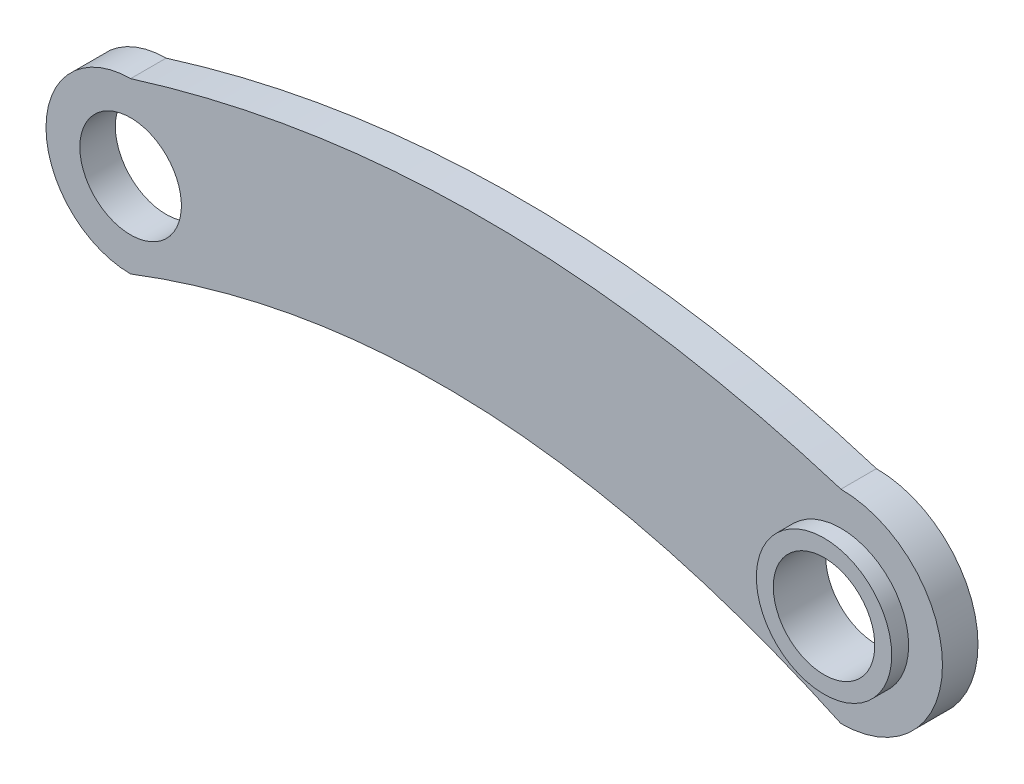
ISO-10303-21;
HEADER;
FILE_DESCRIPTION(('STEP AP214'),'2;1');
FILE_NAME('part.step','',(''),(''),'','','');
FILE_SCHEMA(('AUTOMOTIVE_DESIGN { 1 0 10303 214 1 1 1 1 }'));
ENDSEC;
DATA;
#1=APPLICATION_CONTEXT('core data for automotive mechanical design processes');
#2=APPLICATION_PROTOCOL_DEFINITION('international standard','automotive_design',2000,#1);
#3=PRODUCT_CONTEXT('',#1,'mechanical');
#4=PRODUCT('Part','Part','',(#3));
#5=PRODUCT_RELATED_PRODUCT_CATEGORY('part','',(#4));
#6=PRODUCT_DEFINITION_FORMATION('','',#4);
#7=PRODUCT_DEFINITION_CONTEXT('part definition',#1,'design');
#8=PRODUCT_DEFINITION('design','',#6,#7);
#9=PRODUCT_DEFINITION_SHAPE('','',#8);
#10=(LENGTH_UNIT() NAMED_UNIT(*) SI_UNIT(.MILLI.,.METRE.));
#11=(NAMED_UNIT(*) PLANE_ANGLE_UNIT() SI_UNIT($,.RADIAN.));
#12=(NAMED_UNIT(*) SI_UNIT($,.STERADIAN.) SOLID_ANGLE_UNIT());
#13=UNCERTAINTY_MEASURE_WITH_UNIT(LENGTH_MEASURE(1.E-05),#10,'distance_accuracy_value','');
#14=(GEOMETRIC_REPRESENTATION_CONTEXT(3) GLOBAL_UNCERTAINTY_ASSIGNED_CONTEXT((#13)) GLOBAL_UNIT_ASSIGNED_CONTEXT((#10,
#11,#12)) REPRESENTATION_CONTEXT('',''));
#15=CARTESIAN_POINT('',(0.,0.,0.));
#16=DIRECTION('',(0.,0.,1.));
#17=DIRECTION('',(1.,0.,0.));
#18=AXIS2_PLACEMENT_3D('',#15,#16,#17);
#19=CARTESIAN_POINT('',(0.,0.,21.));
#20=DIRECTION('',(0.,0.,1.));
#21=DIRECTION('',(1.,0.,0.));
#22=AXIS2_PLACEMENT_3D('',#19,#20,#21);
#23=PLANE('',#22);
#24=CARTESIAN_POINT('',(-267.733324074029,336.480114093346,21.));
#25=DIRECTION('',(0.,0.,1.));
#26=DIRECTION('',(1.,0.,0.));
#27=AXIS2_PLACEMENT_3D('',#24,#25,#26);
#28=CIRCLE('',#27,50.);
#29=CARTESIAN_POINT('',(-267.733324074029,386.480114093346,21.));
#30=VERTEX_POINT('',#29);
#31=CARTESIAN_POINT('',(-267.733324074029,286.480114093346,21.));
#32=VERTEX_POINT('',#31);
#33=EDGE_CURVE('E98',#30,#32,#28,.T.);
#34=ORIENTED_EDGE('',*,*,#33,.T.);
#35=CARTESIAN_POINT('',(-267.733324074029,286.480114093346,21.));
#36=CARTESIAN_POINT('',(-61.5362998778427,365.75863406684,21.));
#37=CARTESIAN_POINT('',(152.142574226651,266.270803333194,21.));
#38=B_SPLINE_CURVE_WITH_KNOTS('',2,(#35,#36,#37),.UNSPECIFIED.,.F.,.F.,(3,3),(0.,1.),.UNSPECIFIED.);
#39=CARTESIAN_POINT('',(152.142574226651,266.27080333319,21.));
#40=VERTEX_POINT('',#39);
#41=EDGE_CURVE('E89',#32,#40,#38,.T.);
#42=ORIENTED_EDGE('',*,*,#41,.T.);
#43=CARTESIAN_POINT('',(152.142574226651,326.270803333194,21.));
#44=DIRECTION('',(0.,0.,1.));
#45=DIRECTION('',(1.,0.,0.));
#46=AXIS2_PLACEMENT_3D('',#43,#44,#45);
#47=CIRCLE('',#46,60.0000000000038);
#48=CARTESIAN_POINT('',(152.142574226651,386.270803333198,21.));
#49=VERTEX_POINT('',#48);
#50=EDGE_CURVE('E100',#49,#40,#47,.F.);
#51=ORIENTED_EDGE('',*,*,#50,.F.);
#52=CARTESIAN_POINT('',(-267.733324074029,386.480114093346,21.));
#53=CARTESIAN_POINT('',(-58.3768927784346,451.865914160474,21.));
#54=CARTESIAN_POINT('',(152.142574226651,386.270803333194,21.));
#55=B_SPLINE_CURVE_WITH_KNOTS('',2,(#52,#53,#54),.UNSPECIFIED.,.F.,.F.,(3,3),(0.,1.),.UNSPECIFIED.);
#56=EDGE_CURVE('E109',#30,#49,#55,.T.);
#57=ORIENTED_EDGE('',*,*,#56,.F.);
#58=EDGE_LOOP('',(#34,#42,#51,#57));
#59=FACE_BOUND('',#58,.T.);
#60=CARTESIAN_POINT('',(-267.733324074029,336.480114093346,21.));
#61=DIRECTION('',(0.,0.,1.));
#62=DIRECTION('',(1.,0.,0.));
#63=AXIS2_PLACEMENT_3D('',#60,#61,#62);
#64=CIRCLE('',#63,30.);
#65=CARTESIAN_POINT('',(-297.733324074029,336.480114093346,21.));
#66=VERTEX_POINT('',#65);
#67=EDGE_CURVE('E180',#66,#66,#64,.T.);
#68=ORIENTED_EDGE('',*,*,#67,.F.);
#69=EDGE_LOOP('',(#68));
#70=FACE_BOUND('',#69,.T.);
#71=CARTESIAN_POINT('',(152.142574226651,326.270803333194,21.));
#72=DIRECTION('',(0.,0.,1.));
#73=DIRECTION('',(1.,0.,0.));
#74=AXIS2_PLACEMENT_3D('',#71,#72,#73);
#75=CIRCLE('',#74,40.);
#76=CARTESIAN_POINT('',(192.142574226651,326.270803333194,21.));
#77=VERTEX_POINT('',#76);
#78=EDGE_CURVE('E170',#77,#77,#75,.T.);
#79=ORIENTED_EDGE('',*,*,#78,.F.);
#80=EDGE_LOOP('',(#79));
#81=FACE_BOUND('',#80,.T.);
#82=ADVANCED_FACE('F50',(#59,#70,#81),#23,.T.);
#83=CARTESIAN_POINT('',(-267.733324074029,336.480114093346,21.));
#84=DIRECTION('',(0.,0.,-1.));
#85=DIRECTION('',(-1.,0.,0.));
#86=AXIS2_PLACEMENT_3D('',#83,#84,#85);
#87=CYLINDRICAL_SURFACE('',#86,50.);
#88=CARTESIAN_POINT('',(-267.733324074029,336.480114093346,0.));
#89=DIRECTION('',(0.,0.,1.));
#90=DIRECTION('',(1.,0.,0.));
#91=AXIS2_PLACEMENT_3D('',#88,#89,#90);
#92=CIRCLE('',#91,50.);
#93=CARTESIAN_POINT('',(-267.733324074029,386.480114093346,0.));
#94=VERTEX_POINT('',#93);
#95=CARTESIAN_POINT('',(-267.733324074029,286.480114093346,0.));
#96=VERTEX_POINT('',#95);
#97=EDGE_CURVE('E122',#94,#96,#92,.T.);
#98=ORIENTED_EDGE('',*,*,#97,.T.);
#99=DIRECTION('',(0.,0.,-1.));
#100=VECTOR('',#99,1.);
#101=CARTESIAN_POINT('',(-267.733324074029,286.480114093346,21.));
#102=LINE('',#101,#100);
#103=EDGE_CURVE('E11',#32,#96,#102,.T.);
#104=ORIENTED_EDGE('',*,*,#103,.F.);
#105=ORIENTED_EDGE('',*,*,#33,.F.);
#106=DIRECTION('',(0.,0.,-1.));
#107=VECTOR('',#106,1.);
#108=CARTESIAN_POINT('',(-267.733324074029,386.480114093346,21.));
#109=LINE('',#108,#107);
#110=EDGE_CURVE('E62',#30,#94,#109,.T.);
#111=ORIENTED_EDGE('',*,*,#110,.T.);
#112=EDGE_LOOP('',(#98,#104,#105,#111));
#113=FACE_BOUND('',#112,.T.);
#114=ADVANCED_FACE('F47',(#113),#87,.T.);
#115=DIRECTION('',(0.,0.,-1.));
#116=VECTOR('',#115,1.);
#117=SURFACE_OF_LINEAR_EXTRUSION('',#38,#116);
#118=CARTESIAN_POINT('',(-267.733324074029,286.480114093346,0.));
#119=CARTESIAN_POINT('',(-61.5362998778427,365.75863406684,0.));
#120=CARTESIAN_POINT('',(152.142574226651,266.270803333194,0.));
#121=B_SPLINE_CURVE_WITH_KNOTS('',2,(#118,#119,#120),.UNSPECIFIED.,.F.,.F.,(3,3),(0.,1.),.UNSPECIFIED.);
#122=CARTESIAN_POINT('',(152.142574226651,266.27080333319,0.));
#123=VERTEX_POINT('',#122);
#124=EDGE_CURVE('E102',#96,#123,#121,.T.);
#125=ORIENTED_EDGE('',*,*,#124,.T.);
#126=DIRECTION('',(0.,0.,-1.));
#127=VECTOR('',#126,1.);
#128=CARTESIAN_POINT('',(152.142574226651,266.27080333319,21.));
#129=LINE('',#128,#127);
#130=EDGE_CURVE('E60',#40,#123,#129,.T.);
#131=ORIENTED_EDGE('',*,*,#130,.F.);
#132=ORIENTED_EDGE('',*,*,#41,.F.);
#133=ORIENTED_EDGE('',*,*,#103,.T.);
#134=EDGE_LOOP('',(#125,#131,#132,#133));
#135=FACE_BOUND('',#134,.T.);
#136=ADVANCED_FACE('F103',(#135),#117,.F.);
#137=CARTESIAN_POINT('',(152.142574226651,326.270803333194,21.));
#138=DIRECTION('',(0.,0.,-1.));
#139=DIRECTION('',(-1.,0.,0.));
#140=AXIS2_PLACEMENT_3D('',#137,#138,#139);
#141=CYLINDRICAL_SURFACE('',#140,60.0000000000038);
#142=CARTESIAN_POINT('',(152.142574226651,326.270803333194,0.));
#143=DIRECTION('',(0.,0.,1.));
#144=DIRECTION('',(1.,0.,0.));
#145=AXIS2_PLACEMENT_3D('',#142,#143,#144);
#146=CIRCLE('',#145,60.0000000000038);
#147=CARTESIAN_POINT('',(152.142574226651,386.270803333198,0.));
#148=VERTEX_POINT('',#147);
#149=EDGE_CURVE('E189',#148,#123,#146,.F.);
#150=ORIENTED_EDGE('',*,*,#149,.F.);
#151=DIRECTION('',(0.,0.,-1.));
#152=VECTOR('',#151,1.);
#153=CARTESIAN_POINT('',(152.142574226651,386.270803333198,21.));
#154=LINE('',#153,#152);
#155=EDGE_CURVE('E79',#49,#148,#154,.T.);
#156=ORIENTED_EDGE('',*,*,#155,.F.);
#157=ORIENTED_EDGE('',*,*,#50,.T.);
#158=ORIENTED_EDGE('',*,*,#130,.T.);
#159=EDGE_LOOP('',(#150,#156,#157,#158));
#160=FACE_BOUND('',#159,.T.);
#161=ADVANCED_FACE('F107',(#160),#141,.T.);
#162=DIRECTION('',(0.,0.,-1.));
#163=VECTOR('',#162,1.);
#164=SURFACE_OF_LINEAR_EXTRUSION('',#55,#163);
#165=CARTESIAN_POINT('',(-267.733324074029,386.480114093346,0.));
#166=CARTESIAN_POINT('',(-58.3768927784346,451.865914160474,0.));
#167=CARTESIAN_POINT('',(152.142574226651,386.270803333194,0.));
#168=B_SPLINE_CURVE_WITH_KNOTS('',2,(#165,#166,#167),.UNSPECIFIED.,.F.,.F.,(3,3),(0.,1.),.UNSPECIFIED.);
#169=EDGE_CURVE('E190',#94,#148,#168,.T.);
#170=ORIENTED_EDGE('',*,*,#169,.F.);
#171=ORIENTED_EDGE('',*,*,#110,.F.);
#172=ORIENTED_EDGE('',*,*,#56,.T.);
#173=ORIENTED_EDGE('',*,*,#155,.T.);
#174=EDGE_LOOP('',(#170,#171,#172,#173));
#175=FACE_BOUND('',#174,.T.);
#176=ADVANCED_FACE('F129',(#175),#164,.T.);
#177=CARTESIAN_POINT('',(0.,0.,0.));
#178=DIRECTION('',(0.,0.,1.));
#179=DIRECTION('',(1.,0.,0.));
#180=AXIS2_PLACEMENT_3D('',#177,#178,#179);
#181=PLANE('',#180);
#182=CARTESIAN_POINT('',(-267.733324074029,336.480114093346,0.));
#183=DIRECTION('',(0.,0.,1.));
#184=DIRECTION('',(1.,0.,0.));
#185=AXIS2_PLACEMENT_3D('',#182,#183,#184);
#186=CIRCLE('',#185,30.);
#187=CARTESIAN_POINT('',(-297.733324074029,336.480114093346,0.));
#188=VERTEX_POINT('',#187);
#189=EDGE_CURVE('E182',#188,#188,#186,.T.);
#190=ORIENTED_EDGE('',*,*,#189,.T.);
#191=EDGE_LOOP('',(#190));
#192=FACE_BOUND('',#191,.T.);
#193=CARTESIAN_POINT('',(152.142574226651,326.270803333194,0.));
#194=DIRECTION('',(0.,0.,1.));
#195=DIRECTION('',(1.,0.,0.));
#196=AXIS2_PLACEMENT_3D('',#193,#194,#195);
#197=CIRCLE('',#196,30.);
#198=CARTESIAN_POINT('',(122.142574226651,326.270803333194,0.));
#199=VERTEX_POINT('',#198);
#200=EDGE_CURVE('E172',#199,#199,#197,.T.);
#201=ORIENTED_EDGE('',*,*,#200,.T.);
#202=EDGE_LOOP('',(#201));
#203=FACE_BOUND('',#202,.T.);
#204=ORIENTED_EDGE('',*,*,#97,.F.);
#205=ORIENTED_EDGE('',*,*,#169,.T.);
#206=ORIENTED_EDGE('',*,*,#149,.T.);
#207=ORIENTED_EDGE('',*,*,#124,.F.);
#208=EDGE_LOOP('',(#204,#205,#206,#207));
#209=FACE_BOUND('',#208,.T.);
#210=ADVANCED_FACE('F131',(#192,#203,#209),#181,.F.);
#211=CARTESIAN_POINT('',(152.142574226651,326.270803333194,21.));
#212=DIRECTION('',(0.,0.,-1.));
#213=DIRECTION('',(-1.,0.,0.));
#214=AXIS2_PLACEMENT_3D('',#211,#212,#213);
#215=CYLINDRICAL_SURFACE('',#214,30.);
#216=CARTESIAN_POINT('',(152.142574226651,326.270803333194,31.));
#217=DIRECTION('',(0.,0.,1.));
#218=DIRECTION('',(1.,0.,0.));
#219=AXIS2_PLACEMENT_3D('',#216,#217,#218);
#220=CIRCLE('',#219,30.);
#221=CARTESIAN_POINT('',(122.142574226651,326.270803333194,31.));
#222=VERTEX_POINT('',#221);
#223=EDGE_CURVE('E163',#222,#222,#220,.T.);
#224=CARTESIAN_POINT('',(122.142574226651,326.270803333194,0.));
#225=CARTESIAN_POINT('',(122.142574226651,326.270803333194,0.322916666666667));
#226=CARTESIAN_POINT('',(122.142574226651,326.270803333194,0.645833333333334));
#227=CARTESIAN_POINT('',(122.142574226651,326.270803333194,1.29166666666667));
#228=CARTESIAN_POINT('',(122.142574226651,326.270803333194,1.61458333333333));
#229=CARTESIAN_POINT('',(122.142574226651,326.270803333194,2.26041666666667));
#230=CARTESIAN_POINT('',(122.142574226651,326.270803333194,2.58333333333333));
#231=CARTESIAN_POINT('',(122.142574226651,326.270803333194,3.22916666666667));
#232=CARTESIAN_POINT('',(122.142574226651,326.270803333194,3.55208333333333));
#233=CARTESIAN_POINT('',(122.142574226651,326.270803333194,4.19791666666667));
#234=CARTESIAN_POINT('',(122.142574226651,326.270803333194,4.52083333333333));
#235=CARTESIAN_POINT('',(122.142574226651,326.270803333194,5.16666666666667));
#236=CARTESIAN_POINT('',(122.142574226651,326.270803333194,5.48958333333333));
#237=CARTESIAN_POINT('',(122.142574226651,326.270803333194,6.13541666666667));
#238=CARTESIAN_POINT('',(122.142574226651,326.270803333194,6.45833333333333));
#239=CARTESIAN_POINT('',(122.142574226651,326.270803333194,7.10416666666667));
#240=CARTESIAN_POINT('',(122.142574226651,326.270803333194,7.42708333333333));
#241=CARTESIAN_POINT('',(122.142574226651,326.270803333194,8.07291666666667));
#242=CARTESIAN_POINT('',(122.142574226651,326.270803333194,8.39583333333333));
#243=CARTESIAN_POINT('',(122.142574226651,326.270803333194,9.04166666666667));
#244=CARTESIAN_POINT('',(122.142574226651,326.270803333194,9.36458333333333));
#245=CARTESIAN_POINT('',(122.142574226651,326.270803333194,10.0104166666667));
#246=CARTESIAN_POINT('',(122.142574226651,326.270803333194,10.3333333333333));
#247=CARTESIAN_POINT('',(122.142574226651,326.270803333194,10.9791666666667));
#248=CARTESIAN_POINT('',(122.142574226651,326.270803333194,11.3020833333333));
#249=CARTESIAN_POINT('',(122.142574226651,326.270803333194,11.9479166666667));
#250=CARTESIAN_POINT('',(122.142574226651,326.270803333194,12.2708333333333));
#251=CARTESIAN_POINT('',(122.142574226651,326.270803333194,12.9166666666667));
#252=CARTESIAN_POINT('',(122.142574226651,326.270803333194,13.2395833333333));
#253=CARTESIAN_POINT('',(122.142574226651,326.270803333194,13.8854166666667));
#254=CARTESIAN_POINT('',(122.142574226651,326.270803333194,14.2083333333333));
#255=CARTESIAN_POINT('',(122.142574226651,326.270803333194,14.8541666666667));
#256=CARTESIAN_POINT('',(122.142574226651,326.270803333194,15.1770833333333));
#257=CARTESIAN_POINT('',(122.142574226651,326.270803333194,15.8229166666667));
#258=CARTESIAN_POINT('',(122.142574226651,326.270803333194,16.1458333333333));
#259=CARTESIAN_POINT('',(122.142574226651,326.270803333194,16.7916666666667));
#260=CARTESIAN_POINT('',(122.142574226651,326.270803333194,17.1145833333333));
#261=CARTESIAN_POINT('',(122.142574226651,326.270803333194,17.7604166666667));
#262=CARTESIAN_POINT('',(122.142574226651,326.270803333194,18.0833333333333));
#263=CARTESIAN_POINT('',(122.142574226651,326.270803333194,18.7291666666667));
#264=CARTESIAN_POINT('',(122.142574226651,326.270803333194,19.0520833333333));
#265=CARTESIAN_POINT('',(122.142574226651,326.270803333194,19.6979166666667));
#266=CARTESIAN_POINT('',(122.142574226651,326.270803333194,20.0208333333333));
#267=CARTESIAN_POINT('',(122.142574226651,326.270803333194,20.6666666666667));
#268=CARTESIAN_POINT('',(122.142574226651,326.270803333194,20.9895833333333));
#269=CARTESIAN_POINT('',(122.142574226651,326.270803333194,21.6354166666667));
#270=CARTESIAN_POINT('',(122.142574226651,326.270803333194,21.9583333333333));
#271=CARTESIAN_POINT('',(122.142574226651,326.270803333194,22.6041666666667));
#272=CARTESIAN_POINT('',(122.142574226651,326.270803333194,22.9270833333333));
#273=CARTESIAN_POINT('',(122.142574226651,326.270803333194,23.5729166666667));
#274=CARTESIAN_POINT('',(122.142574226651,326.270803333194,23.8958333333333));
#275=CARTESIAN_POINT('',(122.142574226651,326.270803333194,24.5416666666667));
#276=CARTESIAN_POINT('',(122.142574226651,326.270803333194,24.8645833333333));
#277=CARTESIAN_POINT('',(122.142574226651,326.270803333194,25.5104166666667));
#278=CARTESIAN_POINT('',(122.142574226651,326.270803333194,25.8333333333333));
#279=CARTESIAN_POINT('',(122.142574226651,326.270803333194,26.4791666666667));
#280=CARTESIAN_POINT('',(122.142574226651,326.270803333194,26.8020833333333));
#281=CARTESIAN_POINT('',(122.142574226651,326.270803333194,27.4479166666667));
#282=CARTESIAN_POINT('',(122.142574226651,326.270803333194,27.7708333333333));
#283=CARTESIAN_POINT('',(122.142574226651,326.270803333194,28.4166666666667));
#284=CARTESIAN_POINT('',(122.142574226651,326.270803333194,28.7395833333333));
#285=CARTESIAN_POINT('',(122.142574226651,326.270803333194,29.3854166666667));
#286=CARTESIAN_POINT('',(122.142574226651,326.270803333194,29.7083333333333));
#287=CARTESIAN_POINT('',(122.142574226651,326.270803333194,30.3541666666667));
#288=CARTESIAN_POINT('',(122.142574226651,326.270803333194,30.6770833333333));
#289=CARTESIAN_POINT('',(122.142574226651,326.270803333194,31.));
#290=B_SPLINE_CURVE_WITH_KNOTS('',3,(#224,#225,#226,#227,#228,#229,#230,#231,#232,#233,#234,
#235,#236,#237,#238,#239,#240,#241,#242,#243,#244,#245,#246,#247,#248,#249,#250,#251,#252,#253,
#254,#255,#256,#257,#258,#259,#260,#261,#262,#263,#264,#265,#266,#267,#268,#269,#270,#271,#272,
#273,#274,#275,#276,#277,#278,#279,#280,#281,#282,#283,#284,#285,#286,#287,#288,#289),
.UNSPECIFIED.,.F.,.F.,(4,2,2,2,2,2,2,2,2,2,2,2,2,2,2,2,2,2,2,2,2,2,2,2,2,2,2,2,2,2,2,2,4),(0.,
0.968750000000001,1.9375,2.90625,3.875,4.84375,5.8125,6.78125,7.75,8.71875,9.6875,10.65625,
11.625,12.59375,13.5625,14.53125,15.5,16.46875,17.4375,18.40625,19.375,20.34375,21.3125,
22.28125,23.25,24.21875,25.1875,26.15625,27.125,28.09375,29.0625,30.03125,31.),.UNSPECIFIED.);
#291=EDGE_CURVE('BSEAM142',#199,#222,#290,.T.);
#292=ORIENTED_EDGE('',*,*,#200,.F.);
#293=ORIENTED_EDGE('',*,*,#223,.T.);
#294=ORIENTED_EDGE('',*,*,#291,.T.);
#295=ORIENTED_EDGE('',*,*,#291,.F.);
#296=EDGE_LOOP('',(#292,#294,#293,#295));
#297=FACE_BOUND('',#296,.T.);
#298=ADVANCED_FACE('F142',(#297),#215,.F.);
#299=CARTESIAN_POINT('',(-267.733324074029,336.480114093346,21.));
#300=DIRECTION('',(0.,0.,-1.));
#301=DIRECTION('',(-1.,0.,0.));
#302=AXIS2_PLACEMENT_3D('',#299,#300,#301);
#303=CYLINDRICAL_SURFACE('',#302,30.);
#304=CARTESIAN_POINT('',(-297.733324074029,336.480114093346,21.));
#305=CARTESIAN_POINT('',(-297.733324074029,336.480114093346,20.78125));
#306=CARTESIAN_POINT('',(-297.733324074029,336.480114093346,20.5625));
#307=CARTESIAN_POINT('',(-297.733324074029,336.480114093346,20.125));
#308=CARTESIAN_POINT('',(-297.733324074029,336.480114093346,19.90625));
#309=CARTESIAN_POINT('',(-297.733324074029,336.480114093346,19.46875));
#310=CARTESIAN_POINT('',(-297.733324074029,336.480114093346,19.25));
#311=CARTESIAN_POINT('',(-297.733324074029,336.480114093346,18.8125));
#312=CARTESIAN_POINT('',(-297.733324074029,336.480114093346,18.59375));
#313=CARTESIAN_POINT('',(-297.733324074029,336.480114093346,18.15625));
#314=CARTESIAN_POINT('',(-297.733324074029,336.480114093346,17.9375));
#315=CARTESIAN_POINT('',(-297.733324074029,336.480114093346,17.5));
#316=CARTESIAN_POINT('',(-297.733324074029,336.480114093346,17.28125));
#317=CARTESIAN_POINT('',(-297.733324074029,336.480114093346,16.84375));
#318=CARTESIAN_POINT('',(-297.733324074029,336.480114093346,16.625));
#319=CARTESIAN_POINT('',(-297.733324074029,336.480114093346,16.1875));
#320=CARTESIAN_POINT('',(-297.733324074029,336.480114093346,15.96875));
#321=CARTESIAN_POINT('',(-297.733324074029,336.480114093346,15.53125));
#322=CARTESIAN_POINT('',(-297.733324074029,336.480114093346,15.3125));
#323=CARTESIAN_POINT('',(-297.733324074029,336.480114093346,14.875));
#324=CARTESIAN_POINT('',(-297.733324074029,336.480114093346,14.65625));
#325=CARTESIAN_POINT('',(-297.733324074029,336.480114093346,14.21875));
#326=CARTESIAN_POINT('',(-297.733324074029,336.480114093346,14.));
#327=CARTESIAN_POINT('',(-297.733324074029,336.480114093346,13.5625));
#328=CARTESIAN_POINT('',(-297.733324074029,336.480114093346,13.34375));
#329=CARTESIAN_POINT('',(-297.733324074029,336.480114093346,12.90625));
#330=CARTESIAN_POINT('',(-297.733324074029,336.480114093346,12.6875));
#331=CARTESIAN_POINT('',(-297.733324074029,336.480114093346,12.25));
#332=CARTESIAN_POINT('',(-297.733324074029,336.480114093346,12.03125));
#333=CARTESIAN_POINT('',(-297.733324074029,336.480114093346,11.59375));
#334=CARTESIAN_POINT('',(-297.733324074029,336.480114093346,11.375));
#335=CARTESIAN_POINT('',(-297.733324074029,336.480114093346,10.9375));
#336=CARTESIAN_POINT('',(-297.733324074029,336.480114093346,10.71875));
#337=CARTESIAN_POINT('',(-297.733324074029,336.480114093346,10.28125));
#338=CARTESIAN_POINT('',(-297.733324074029,336.480114093346,10.0625));
#339=CARTESIAN_POINT('',(-297.733324074029,336.480114093346,9.625));
#340=CARTESIAN_POINT('',(-297.733324074029,336.480114093346,9.40625));
#341=CARTESIAN_POINT('',(-297.733324074029,336.480114093346,8.96875));
#342=CARTESIAN_POINT('',(-297.733324074029,336.480114093346,8.75));
#343=CARTESIAN_POINT('',(-297.733324074029,336.480114093346,8.3125));
#344=CARTESIAN_POINT('',(-297.733324074029,336.480114093346,8.09375));
#345=CARTESIAN_POINT('',(-297.733324074029,336.480114093346,7.65625));
#346=CARTESIAN_POINT('',(-297.733324074029,336.480114093346,7.4375));
#347=CARTESIAN_POINT('',(-297.733324074029,336.480114093346,7.));
#348=CARTESIAN_POINT('',(-297.733324074029,336.480114093346,6.78125));
#349=CARTESIAN_POINT('',(-297.733324074029,336.480114093346,6.34375));
#350=CARTESIAN_POINT('',(-297.733324074029,336.480114093346,6.125));
#351=CARTESIAN_POINT('',(-297.733324074029,336.480114093346,5.6875));
#352=CARTESIAN_POINT('',(-297.733324074029,336.480114093346,5.46875));
#353=CARTESIAN_POINT('',(-297.733324074029,336.480114093346,5.03125));
#354=CARTESIAN_POINT('',(-297.733324074029,336.480114093346,4.8125));
#355=CARTESIAN_POINT('',(-297.733324074029,336.480114093346,4.375));
#356=CARTESIAN_POINT('',(-297.733324074029,336.480114093346,4.15625));
#357=CARTESIAN_POINT('',(-297.733324074029,336.480114093346,3.71875));
#358=CARTESIAN_POINT('',(-297.733324074029,336.480114093346,3.5));
#359=CARTESIAN_POINT('',(-297.733324074029,336.480114093346,3.0625));
#360=CARTESIAN_POINT('',(-297.733324074029,336.480114093346,2.84375));
#361=CARTESIAN_POINT('',(-297.733324074029,336.480114093346,2.40625));
#362=CARTESIAN_POINT('',(-297.733324074029,336.480114093346,2.1875));
#363=CARTESIAN_POINT('',(-297.733324074029,336.480114093346,1.75));
#364=CARTESIAN_POINT('',(-297.733324074029,336.480114093346,1.53125));
#365=CARTESIAN_POINT('',(-297.733324074029,336.480114093346,1.09375));
#366=CARTESIAN_POINT('',(-297.733324074029,336.480114093346,0.875000000000001));
#367=CARTESIAN_POINT('',(-297.733324074029,336.480114093346,0.4375));
#368=CARTESIAN_POINT('',(-297.733324074029,336.480114093346,0.21875));
#369=CARTESIAN_POINT('',(-297.733324074029,336.480114093346,0.));
#370=B_SPLINE_CURVE_WITH_KNOTS('',3,(#304,#305,#306,#307,#308,#309,#310,#311,#312,#313,#314,
#315,#316,#317,#318,#319,#320,#321,#322,#323,#324,#325,#326,#327,#328,#329,#330,#331,#332,#333,
#334,#335,#336,#337,#338,#339,#340,#341,#342,#343,#344,#345,#346,#347,#348,#349,#350,#351,#352,
#353,#354,#355,#356,#357,#358,#359,#360,#361,#362,#363,#364,#365,#366,#367,#368,#369),
.UNSPECIFIED.,.F.,.F.,(4,2,2,2,2,2,2,2,2,2,2,2,2,2,2,2,2,2,2,2,2,2,2,2,2,2,2,2,2,2,2,2,4),(0.,
0.656249999999997,1.3125,1.96875,2.625,3.28125,3.9375,4.59375,5.25,5.90625,6.5625,7.21875,7.875,
8.53125,9.1875,9.84375,10.5,11.15625,11.8125,12.46875,13.125,13.78125,14.4375,15.09375,15.75,
16.40625,17.0625,17.71875,18.375,19.03125,19.6875,20.34375,21.),.UNSPECIFIED.);
#371=EDGE_CURVE('BSEAM144',#66,#188,#370,.T.);
#372=ORIENTED_EDGE('',*,*,#67,.T.);
#373=ORIENTED_EDGE('',*,*,#189,.F.);
#374=ORIENTED_EDGE('',*,*,#371,.T.);
#375=ORIENTED_EDGE('',*,*,#371,.F.);
#376=EDGE_LOOP('',(#372,#374,#373,#375));
#377=FACE_BOUND('',#376,.T.);
#378=ADVANCED_FACE('F144',(#377),#303,.F.);
#379=CARTESIAN_POINT('',(152.142574226651,326.270803333194,31.));
#380=DIRECTION('',(0.,0.,1.));
#381=DIRECTION('',(1.,0.,0.));
#382=AXIS2_PLACEMENT_3D('',#379,#380,#381);
#383=PLANE('',#382);
#384=CARTESIAN_POINT('',(152.142574226651,326.270803333194,31.));
#385=DIRECTION('',(0.,0.,1.));
#386=DIRECTION('',(1.,0.,0.));
#387=AXIS2_PLACEMENT_3D('',#384,#385,#386);
#388=CIRCLE('',#387,40.);
#389=CARTESIAN_POINT('',(192.142574226651,326.270803333194,31.));
#390=VERTEX_POINT('',#389);
#391=EDGE_CURVE('E161',#390,#390,#388,.T.);
#392=ORIENTED_EDGE('',*,*,#391,.T.);
#393=EDGE_LOOP('',(#392));
#394=FACE_BOUND('',#393,.T.);
#395=ORIENTED_EDGE('',*,*,#223,.F.);
#396=EDGE_LOOP('',(#395));
#397=FACE_BOUND('',#396,.T.);
#398=ADVANCED_FACE('F149',(#394,#397),#383,.T.);
#399=CARTESIAN_POINT('',(152.142574226651,326.270803333194,31.));
#400=DIRECTION('',(0.,0.,-1.));
#401=DIRECTION('',(-1.,0.,0.));
#402=AXIS2_PLACEMENT_3D('',#399,#400,#401);
#403=CYLINDRICAL_SURFACE('',#402,40.);
#404=ORIENTED_EDGE('',*,*,#391,.F.);
#405=EDGE_LOOP('',(#404));
#406=FACE_BOUND('',#405,.T.);
#407=ORIENTED_EDGE('',*,*,#78,.T.);
#408=EDGE_LOOP('',(#407));
#409=FACE_BOUND('',#408,.T.);
#410=ADVANCED_FACE('F151',(#406,#409),#403,.T.);
#411=CLOSED_SHELL('',(#82,#114,#136,#161,#176,#210,#298,#378,#398,#410));
#412=MANIFOLD_SOLID_BREP('B2',#411);
#413=ADVANCED_BREP_SHAPE_REPRESENTATION('',(#18,#412),#14);
#414=SHAPE_DEFINITION_REPRESENTATION(#9,#413);
ENDSEC;
END-ISO-10303-21;
